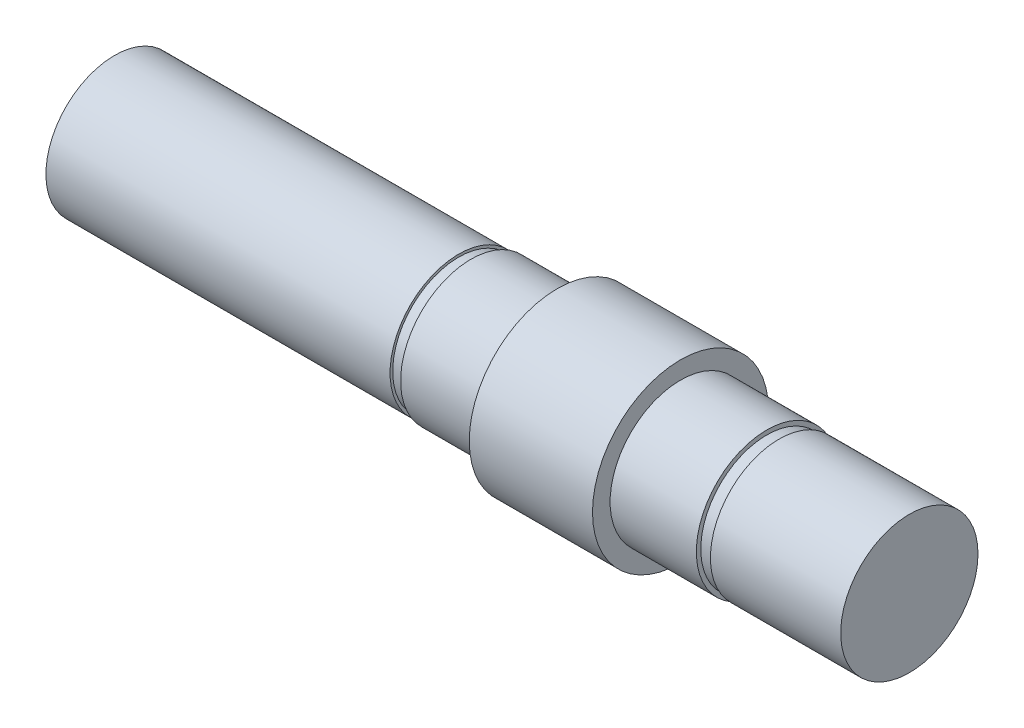
ISO-10303-21;
HEADER;
FILE_DESCRIPTION(('STEP AP214'),'2;1');
FILE_NAME('part.step','',(''),(''),'','','');
FILE_SCHEMA(('AUTOMOTIVE_DESIGN { 1 0 10303 214 1 1 1 1 }'));
ENDSEC;
DATA;
#1=APPLICATION_CONTEXT('core data for automotive mechanical design processes');
#2=APPLICATION_PROTOCOL_DEFINITION('international standard','automotive_design',2000,#1);
#3=PRODUCT_CONTEXT('',#1,'mechanical');
#4=PRODUCT('Part','Part','',(#3));
#5=PRODUCT_RELATED_PRODUCT_CATEGORY('part','',(#4));
#6=PRODUCT_DEFINITION_FORMATION('','',#4);
#7=PRODUCT_DEFINITION_CONTEXT('part definition',#1,'design');
#8=PRODUCT_DEFINITION('design','',#6,#7);
#9=PRODUCT_DEFINITION_SHAPE('','',#8);
#10=(LENGTH_UNIT() NAMED_UNIT(*) SI_UNIT(.MILLI.,.METRE.));
#11=(NAMED_UNIT(*) PLANE_ANGLE_UNIT() SI_UNIT($,.RADIAN.));
#12=(NAMED_UNIT(*) SI_UNIT($,.STERADIAN.) SOLID_ANGLE_UNIT());
#13=UNCERTAINTY_MEASURE_WITH_UNIT(LENGTH_MEASURE(1.E-05),#10,'distance_accuracy_value','');
#14=(GEOMETRIC_REPRESENTATION_CONTEXT(3) GLOBAL_UNCERTAINTY_ASSIGNED_CONTEXT((#13)) GLOBAL_UNIT_ASSIGNED_CONTEXT((#10,
#11,#12)) REPRESENTATION_CONTEXT('',''));
#15=CARTESIAN_POINT('',(0.,0.,0.));
#16=DIRECTION('',(0.,0.,1.));
#17=DIRECTION('',(1.,0.,0.));
#18=AXIS2_PLACEMENT_3D('',#15,#16,#17);
#19=CARTESIAN_POINT('',(0.,3.9,0.));
#20=DIRECTION('',(1.,0.,0.));
#21=DIRECTION('',(0.,0.,-1.));
#22=AXIS2_PLACEMENT_3D('',#19,#20,#21);
#23=PLANE('',#22);
#24=CARTESIAN_POINT('',(0.,0.,0.));
#25=DIRECTION('',(1.,0.,0.));
#26=DIRECTION('',(0.,0.,-1.));
#27=AXIS2_PLACEMENT_3D('',#24,#25,#26);
#28=CIRCLE('',#27,3.9);
#29=CARTESIAN_POINT('',(0.,0.,-3.9));
#30=VERTEX_POINT('',#29);
#31=EDGE_CURVE('E79',#30,#30,#28,.T.);
#32=ORIENTED_EDGE('',*,*,#31,.T.);
#33=EDGE_LOOP('',(#32));
#34=FACE_BOUND('',#33,.T.);
#35=ADVANCED_FACE('F41',(#34),#23,.T.);
#36=CARTESIAN_POINT('',(-45.15,0.,0.));
#37=DIRECTION('',(-1.,0.,0.));
#38=DIRECTION('',(0.,0.,1.));
#39=AXIS2_PLACEMENT_3D('',#36,#37,#38);
#40=PLANE('',#39);
#41=DIRECTION('',(0.,0.,1.));
#42=VECTOR('',#41,1.);
#43=CARTESIAN_POINT('',(-45.15,-3.34813380855661,-2.));
#44=LINE('',#43,#42);
#45=CARTESIAN_POINT('',(-45.15,-3.34813380855661,-2.));
#46=VERTEX_POINT('',#45);
#47=CARTESIAN_POINT('',(-45.15,-3.34813380855661,2.));
#48=VERTEX_POINT('',#47);
#49=EDGE_CURVE('E74',#46,#48,#44,.T.);
#50=ORIENTED_EDGE('',*,*,#49,.T.);
#51=CARTESIAN_POINT('',(-45.15,0.,0.));
#52=DIRECTION('',(1.,0.,0.));
#53=DIRECTION('',(0.,0.,-1.));
#54=AXIS2_PLACEMENT_3D('',#51,#52,#53);
#55=CIRCLE('',#54,3.9);
#56=EDGE_CURVE('E11',#46,#48,#55,.T.);
#57=ORIENTED_EDGE('',*,*,#56,.F.);
#58=EDGE_LOOP('',(#50,#57));
#59=FACE_BOUND('',#58,.T.);
#60=ADVANCED_FACE('F123',(#59),#40,.T.);
#61=CARTESIAN_POINT('',(0.,0.,0.));
#62=DIRECTION('',(1.,0.,0.));
#63=DIRECTION('',(0.,0.,-1.));
#64=AXIS2_PLACEMENT_3D('',#61,#62,#63);
#65=CYLINDRICAL_SURFACE('',#64,3.9);
#66=DIRECTION('',(1.,0.,0.));
#67=VECTOR('',#66,1.);
#68=CARTESIAN_POINT('',(-45.15,-3.34813380855661,2.));
#69=LINE('',#68,#67);
#70=CARTESIAN_POINT('',(-26.3000000000001,-3.34813380855661,2.));
#71=VERTEX_POINT('',#70);
#72=EDGE_CURVE('E62',#48,#71,#69,.T.);
#73=ORIENTED_EDGE('',*,*,#72,.T.);
#74=CARTESIAN_POINT('',(-26.3000000000001,0.,0.));
#75=DIRECTION('',(1.,0.,0.));
#76=DIRECTION('',(0.,0.,-1.));
#77=AXIS2_PLACEMENT_3D('',#74,#75,#76);
#78=CIRCLE('',#77,3.89999999999998);
#79=CARTESIAN_POINT('',(-26.3000000000001,-3.34813380855663,-2.00000000000001));
#80=VERTEX_POINT('',#79);
#81=EDGE_CURVE('E67',#71,#80,#78,.T.);
#82=ORIENTED_EDGE('',*,*,#81,.T.);
#83=DIRECTION('',(1.,0.,0.));
#84=VECTOR('',#83,1.);
#85=CARTESIAN_POINT('',(-45.15,-3.34813380855661,-2.));
#86=LINE('',#85,#84);
#87=EDGE_CURVE('E73',#46,#80,#86,.T.);
#88=ORIENTED_EDGE('',*,*,#87,.F.);
#89=ORIENTED_EDGE('',*,*,#56,.T.);
#90=EDGE_LOOP('',(#73,#82,#88,#89));
#91=FACE_BOUND('',#90,.T.);
#92=CARTESIAN_POINT('',(-25.6000000000001,0.,0.));
#93=DIRECTION('',(1.,0.,0.));
#94=DIRECTION('',(0.,0.,-1.));
#95=AXIS2_PLACEMENT_3D('',#92,#93,#94);
#96=CIRCLE('',#95,3.9);
#97=CARTESIAN_POINT('',(-25.6000000000001,0.,-3.9));
#98=VERTEX_POINT('',#97);
#99=EDGE_CURVE('E48',#98,#98,#96,.T.);
#100=ORIENTED_EDGE('',*,*,#99,.F.);
#101=EDGE_LOOP('',(#100));
#102=FACE_BOUND('',#101,.T.);
#103=ADVANCED_FACE('F76',(#91,#102),#65,.T.);
#104=CARTESIAN_POINT('',(-25.6000000000001,3.9,0.));
#105=DIRECTION('',(1.,0.,0.));
#106=DIRECTION('',(0.,0.,-1.));
#107=AXIS2_PLACEMENT_3D('',#104,#105,#106);
#108=PLANE('',#107);
#109=ORIENTED_EDGE('',*,*,#99,.T.);
#110=EDGE_LOOP('',(#109));
#111=FACE_BOUND('',#110,.T.);
#112=CARTESIAN_POINT('',(-25.6000000000001,0.,0.));
#113=DIRECTION('',(1.,0.,0.));
#114=DIRECTION('',(0.,0.,-1.));
#115=AXIS2_PLACEMENT_3D('',#112,#113,#114);
#116=CIRCLE('',#115,3.75);
#117=CARTESIAN_POINT('',(-25.6000000000001,0.,-3.75));
#118=VERTEX_POINT('',#117);
#119=EDGE_CURVE('E115',#118,#118,#116,.T.);
#120=ORIENTED_EDGE('',*,*,#119,.F.);
#121=EDGE_LOOP('',(#120));
#122=FACE_BOUND('',#121,.T.);
#123=ADVANCED_FACE('F120',(#111,#122),#108,.T.);
#124=CARTESIAN_POINT('',(0.,0.,0.));
#125=DIRECTION('',(1.,0.,0.));
#126=DIRECTION('',(0.,0.,-1.));
#127=AXIS2_PLACEMENT_3D('',#124,#125,#126);
#128=CYLINDRICAL_SURFACE('',#127,3.75);
#129=ORIENTED_EDGE('',*,*,#119,.T.);
#130=EDGE_LOOP('',(#129));
#131=FACE_BOUND('',#130,.T.);
#132=CARTESIAN_POINT('',(-24.9,0.,0.));
#133=DIRECTION('',(1.,0.,0.));
#134=DIRECTION('',(0.,0.,-1.));
#135=AXIS2_PLACEMENT_3D('',#132,#133,#134);
#136=CIRCLE('',#135,3.75);
#137=CARTESIAN_POINT('',(-24.9,0.,-3.75));
#138=VERTEX_POINT('',#137);
#139=EDGE_CURVE('E112',#138,#138,#136,.T.);
#140=ORIENTED_EDGE('',*,*,#139,.F.);
#141=EDGE_LOOP('',(#140));
#142=FACE_BOUND('',#141,.T.);
#143=ADVANCED_FACE('F129',(#131,#142),#128,.T.);
#144=CARTESIAN_POINT('',(-24.9,3.75,0.));
#145=DIRECTION('',(-1.,0.,0.));
#146=DIRECTION('',(0.,0.,1.));
#147=AXIS2_PLACEMENT_3D('',#144,#145,#146);
#148=PLANE('',#147);
#149=ORIENTED_EDGE('',*,*,#139,.T.);
#150=EDGE_LOOP('',(#149));
#151=FACE_BOUND('',#150,.T.);
#152=CARTESIAN_POINT('',(-24.9,0.,0.));
#153=DIRECTION('',(1.,0.,0.));
#154=DIRECTION('',(0.,0.,-1.));
#155=AXIS2_PLACEMENT_3D('',#152,#153,#154);
#156=CIRCLE('',#155,4.);
#157=CARTESIAN_POINT('',(-24.9,0.,-4.));
#158=VERTEX_POINT('',#157);
#159=EDGE_CURVE('E109',#158,#158,#156,.T.);
#160=ORIENTED_EDGE('',*,*,#159,.F.);
#161=EDGE_LOOP('',(#160));
#162=FACE_BOUND('',#161,.T.);
#163=ADVANCED_FACE('F179',(#151,#162),#148,.T.);
#164=CARTESIAN_POINT('',(0.,0.,0.));
#165=DIRECTION('',(1.,0.,0.));
#166=DIRECTION('',(0.,0.,-1.));
#167=AXIS2_PLACEMENT_3D('',#164,#165,#166);
#168=CYLINDRICAL_SURFACE('',#167,4.);
#169=ORIENTED_EDGE('',*,*,#159,.T.);
#170=EDGE_LOOP('',(#169));
#171=FACE_BOUND('',#170,.T.);
#172=CARTESIAN_POINT('',(-20.,0.,0.));
#173=DIRECTION('',(1.,0.,0.));
#174=DIRECTION('',(0.,0.,-1.));
#175=AXIS2_PLACEMENT_3D('',#172,#173,#174);
#176=CIRCLE('',#175,4.);
#177=CARTESIAN_POINT('',(-20.,0.,-4.));
#178=VERTEX_POINT('',#177);
#179=EDGE_CURVE('E106',#178,#178,#176,.T.);
#180=ORIENTED_EDGE('',*,*,#179,.F.);
#181=EDGE_LOOP('',(#180));
#182=FACE_BOUND('',#181,.T.);
#183=ADVANCED_FACE('F175',(#171,#182),#168,.T.);
#184=CARTESIAN_POINT('',(-20.,4.,0.));
#185=DIRECTION('',(-1.,0.,0.));
#186=DIRECTION('',(0.,0.,1.));
#187=AXIS2_PLACEMENT_3D('',#184,#185,#186);
#188=PLANE('',#187);
#189=ORIENTED_EDGE('',*,*,#179,.T.);
#190=EDGE_LOOP('',(#189));
#191=FACE_BOUND('',#190,.T.);
#192=CARTESIAN_POINT('',(-20.,0.,0.));
#193=DIRECTION('',(1.,0.,0.));
#194=DIRECTION('',(0.,0.,-1.));
#195=AXIS2_PLACEMENT_3D('',#192,#193,#194);
#196=CIRCLE('',#195,5.);
#197=CARTESIAN_POINT('',(-20.,0.,-5.));
#198=VERTEX_POINT('',#197);
#199=EDGE_CURVE('E103',#198,#198,#196,.T.);
#200=ORIENTED_EDGE('',*,*,#199,.F.);
#201=EDGE_LOOP('',(#200));
#202=FACE_BOUND('',#201,.T.);
#203=ADVANCED_FACE('F171',(#191,#202),#188,.T.);
#204=CARTESIAN_POINT('',(0.,0.,0.));
#205=DIRECTION('',(1.,0.,0.));
#206=DIRECTION('',(0.,0.,-1.));
#207=AXIS2_PLACEMENT_3D('',#204,#205,#206);
#208=CYLINDRICAL_SURFACE('',#207,5.);
#209=ORIENTED_EDGE('',*,*,#199,.T.);
#210=EDGE_LOOP('',(#209));
#211=FACE_BOUND('',#210,.T.);
#212=CARTESIAN_POINT('',(-13.,0.,0.));
#213=DIRECTION('',(1.,0.,0.));
#214=DIRECTION('',(0.,0.,-1.));
#215=AXIS2_PLACEMENT_3D('',#212,#213,#214);
#216=CIRCLE('',#215,5.);
#217=CARTESIAN_POINT('',(-13.,0.,-5.));
#218=VERTEX_POINT('',#217);
#219=EDGE_CURVE('E100',#218,#218,#216,.T.);
#220=ORIENTED_EDGE('',*,*,#219,.F.);
#221=EDGE_LOOP('',(#220));
#222=FACE_BOUND('',#221,.T.);
#223=ADVANCED_FACE('F167',(#211,#222),#208,.T.);
#224=CARTESIAN_POINT('',(-13.,5.,0.));
#225=DIRECTION('',(1.,0.,0.));
#226=DIRECTION('',(0.,0.,-1.));
#227=AXIS2_PLACEMENT_3D('',#224,#225,#226);
#228=PLANE('',#227);
#229=ORIENTED_EDGE('',*,*,#219,.T.);
#230=EDGE_LOOP('',(#229));
#231=FACE_BOUND('',#230,.T.);
#232=CARTESIAN_POINT('',(-13.,0.,0.));
#233=DIRECTION('',(1.,0.,0.));
#234=DIRECTION('',(0.,0.,-1.));
#235=AXIS2_PLACEMENT_3D('',#232,#233,#234);
#236=CIRCLE('',#235,4.);
#237=CARTESIAN_POINT('',(-13.,0.,-4.));
#238=VERTEX_POINT('',#237);
#239=EDGE_CURVE('E97',#238,#238,#236,.T.);
#240=ORIENTED_EDGE('',*,*,#239,.F.);
#241=EDGE_LOOP('',(#240));
#242=FACE_BOUND('',#241,.T.);
#243=ADVANCED_FACE('F163',(#231,#242),#228,.T.);
#244=CARTESIAN_POINT('',(0.,0.,0.));
#245=DIRECTION('',(1.,0.,0.));
#246=DIRECTION('',(0.,0.,-1.));
#247=AXIS2_PLACEMENT_3D('',#244,#245,#246);
#248=CYLINDRICAL_SURFACE('',#247,4.);
#249=ORIENTED_EDGE('',*,*,#239,.T.);
#250=EDGE_LOOP('',(#249));
#251=FACE_BOUND('',#250,.T.);
#252=CARTESIAN_POINT('',(-8.10000000000004,0.,0.));
#253=DIRECTION('',(1.,0.,0.));
#254=DIRECTION('',(0.,0.,-1.));
#255=AXIS2_PLACEMENT_3D('',#252,#253,#254);
#256=CIRCLE('',#255,4.);
#257=CARTESIAN_POINT('',(-8.10000000000004,0.,-4.));
#258=VERTEX_POINT('',#257);
#259=EDGE_CURVE('E94',#258,#258,#256,.T.);
#260=ORIENTED_EDGE('',*,*,#259,.F.);
#261=EDGE_LOOP('',(#260));
#262=FACE_BOUND('',#261,.T.);
#263=ADVANCED_FACE('F159',(#251,#262),#248,.T.);
#264=CARTESIAN_POINT('',(-8.10000000000004,4.,0.));
#265=DIRECTION('',(1.,0.,0.));
#266=DIRECTION('',(0.,0.,-1.));
#267=AXIS2_PLACEMENT_3D('',#264,#265,#266);
#268=PLANE('',#267);
#269=ORIENTED_EDGE('',*,*,#259,.T.);
#270=EDGE_LOOP('',(#269));
#271=FACE_BOUND('',#270,.T.);
#272=CARTESIAN_POINT('',(-8.10000000000004,0.,0.));
#273=DIRECTION('',(1.,0.,0.));
#274=DIRECTION('',(0.,0.,-1.));
#275=AXIS2_PLACEMENT_3D('',#272,#273,#274);
#276=CIRCLE('',#275,3.75);
#277=CARTESIAN_POINT('',(-8.10000000000004,0.,-3.75));
#278=VERTEX_POINT('',#277);
#279=EDGE_CURVE('E91',#278,#278,#276,.T.);
#280=ORIENTED_EDGE('',*,*,#279,.F.);
#281=EDGE_LOOP('',(#280));
#282=FACE_BOUND('',#281,.T.);
#283=ADVANCED_FACE('F155',(#271,#282),#268,.T.);
#284=CARTESIAN_POINT('',(0.,0.,0.));
#285=DIRECTION('',(1.,0.,0.));
#286=DIRECTION('',(0.,0.,-1.));
#287=AXIS2_PLACEMENT_3D('',#284,#285,#286);
#288=CYLINDRICAL_SURFACE('',#287,3.75);
#289=ORIENTED_EDGE('',*,*,#279,.T.);
#290=EDGE_LOOP('',(#289));
#291=FACE_BOUND('',#290,.T.);
#292=CARTESIAN_POINT('',(-7.40000000000003,0.,0.));
#293=DIRECTION('',(1.,0.,0.));
#294=DIRECTION('',(0.,0.,-1.));
#295=AXIS2_PLACEMENT_3D('',#292,#293,#294);
#296=CIRCLE('',#295,3.75);
#297=CARTESIAN_POINT('',(-7.40000000000003,0.,-3.75));
#298=VERTEX_POINT('',#297);
#299=EDGE_CURVE('E88',#298,#298,#296,.T.);
#300=ORIENTED_EDGE('',*,*,#299,.F.);
#301=EDGE_LOOP('',(#300));
#302=FACE_BOUND('',#301,.T.);
#303=ADVANCED_FACE('F148',(#291,#302),#288,.T.);
#304=CARTESIAN_POINT('',(-7.40000000000003,3.75,0.));
#305=DIRECTION('',(-1.,0.,0.));
#306=DIRECTION('',(0.,0.,1.));
#307=AXIS2_PLACEMENT_3D('',#304,#305,#306);
#308=PLANE('',#307);
#309=ORIENTED_EDGE('',*,*,#299,.T.);
#310=EDGE_LOOP('',(#309));
#311=FACE_BOUND('',#310,.T.);
#312=CARTESIAN_POINT('',(-7.40000000000003,0.,0.));
#313=DIRECTION('',(1.,0.,0.));
#314=DIRECTION('',(0.,0.,-1.));
#315=AXIS2_PLACEMENT_3D('',#312,#313,#314);
#316=CIRCLE('',#315,3.9);
#317=CARTESIAN_POINT('',(-7.40000000000003,0.,-3.9));
#318=VERTEX_POINT('',#317);
#319=EDGE_CURVE('E82',#318,#318,#316,.T.);
#320=ORIENTED_EDGE('',*,*,#319,.F.);
#321=EDGE_LOOP('',(#320));
#322=FACE_BOUND('',#321,.T.);
#323=ADVANCED_FACE('F140',(#311,#322),#308,.T.);
#324=CARTESIAN_POINT('',(0.,0.,0.));
#325=DIRECTION('',(1.,0.,0.));
#326=DIRECTION('',(0.,0.,-1.));
#327=AXIS2_PLACEMENT_3D('',#324,#325,#326);
#328=CYLINDRICAL_SURFACE('',#327,3.9);
#329=ORIENTED_EDGE('',*,*,#319,.T.);
#330=EDGE_LOOP('',(#329));
#331=FACE_BOUND('',#330,.T.);
#332=ORIENTED_EDGE('',*,*,#31,.F.);
#333=EDGE_LOOP('',(#332));
#334=FACE_BOUND('',#333,.T.);
#335=ADVANCED_FACE('F138',(#331,#334),#328,.T.);
#336=CARTESIAN_POINT('',(-45.15,-3.34813380855661,-2.));
#337=DIRECTION('',(0.,1.,0.));
#338=DIRECTION('',(0.,0.,1.));
#339=AXIS2_PLACEMENT_3D('',#336,#337,#338);
#340=PLANE('',#339);
#341=DIRECTION('',(0.,0.,1.));
#342=VECTOR('',#341,1.);
#343=CARTESIAN_POINT('',(-26.3000000000001,-3.34813380855661,-2.));
#344=LINE('',#343,#342);
#345=EDGE_CURVE('E54',#80,#71,#344,.T.);
#346=ORIENTED_EDGE('',*,*,#345,.T.);
#347=ORIENTED_EDGE('',*,*,#72,.F.);
#348=ORIENTED_EDGE('',*,*,#49,.F.);
#349=ORIENTED_EDGE('',*,*,#87,.T.);
#350=EDGE_LOOP('',(#346,#347,#348,#349));
#351=FACE_BOUND('',#350,.T.);
#352=ADVANCED_FACE('F72',(#351),#340,.F.);
#353=CARTESIAN_POINT('',(-26.3000000000001,0.,0.));
#354=DIRECTION('',(1.,0.,0.));
#355=DIRECTION('',(0.,0.,-1.));
#356=AXIS2_PLACEMENT_3D('',#353,#354,#355);
#357=PLANE('',#356);
#358=ORIENTED_EDGE('',*,*,#81,.F.);
#359=ORIENTED_EDGE('',*,*,#345,.F.);
#360=EDGE_LOOP('',(#358,#359));
#361=FACE_BOUND('',#360,.T.);
#362=ADVANCED_FACE('F68',(#361),#357,.F.);
#363=CLOSED_SHELL('',(#35,#60,#103,#123,#143,#163,#183,#203,#223,#243,#263,#283,#303,#323,#335,
#352,#362));
#364=MANIFOLD_SOLID_BREP('B2',#363);
#365=ADVANCED_BREP_SHAPE_REPRESENTATION('',(#18,#364),#14);
#366=SHAPE_DEFINITION_REPRESENTATION(#9,#365);
ENDSEC;
END-ISO-10303-21;
